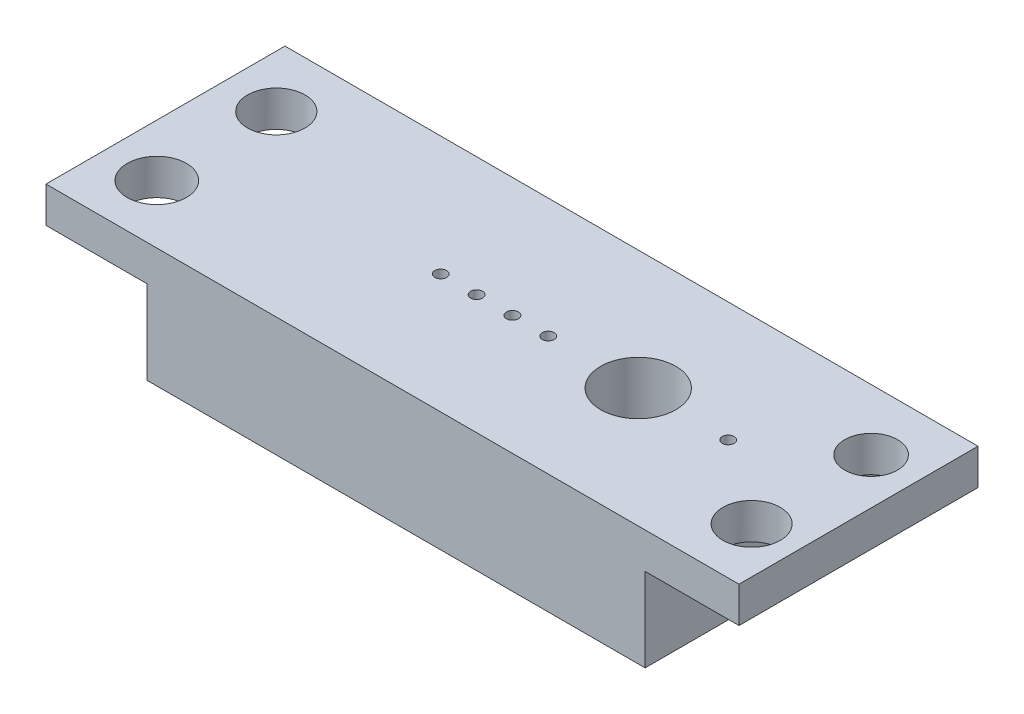
ISO-10303-21;
HEADER;
FILE_DESCRIPTION(('STEP AP214'),'2;1');
FILE_NAME('part.step','',(''),(''),'','','');
FILE_SCHEMA(('AUTOMOTIVE_DESIGN { 1 0 10303 214 1 1 1 1 }'));
ENDSEC;
DATA;
#1=APPLICATION_CONTEXT('core data for automotive mechanical design processes');
#2=APPLICATION_PROTOCOL_DEFINITION('international standard','automotive_design',2000,#1);
#3=PRODUCT_CONTEXT('',#1,'mechanical');
#4=PRODUCT('Part','Part','',(#3));
#5=PRODUCT_RELATED_PRODUCT_CATEGORY('part','',(#4));
#6=PRODUCT_DEFINITION_FORMATION('','',#4);
#7=PRODUCT_DEFINITION_CONTEXT('part definition',#1,'design');
#8=PRODUCT_DEFINITION('design','',#6,#7);
#9=PRODUCT_DEFINITION_SHAPE('','',#8);
#10=(LENGTH_UNIT() NAMED_UNIT(*) SI_UNIT(.MILLI.,.METRE.));
#11=(NAMED_UNIT(*) PLANE_ANGLE_UNIT() SI_UNIT($,.RADIAN.));
#12=(NAMED_UNIT(*) SI_UNIT($,.STERADIAN.) SOLID_ANGLE_UNIT());
#13=UNCERTAINTY_MEASURE_WITH_UNIT(LENGTH_MEASURE(1.E-05),#10,'distance_accuracy_value','');
#14=(GEOMETRIC_REPRESENTATION_CONTEXT(3) GLOBAL_UNCERTAINTY_ASSIGNED_CONTEXT((#13)) GLOBAL_UNIT_ASSIGNED_CONTEXT((#10,
#11,#12)) REPRESENTATION_CONTEXT('',''));
#15=CARTESIAN_POINT('',(0.,0.,0.));
#16=DIRECTION('',(0.,0.,1.));
#17=DIRECTION('',(1.,0.,0.));
#18=AXIS2_PLACEMENT_3D('',#15,#16,#17);
#19=CARTESIAN_POINT('',(0.,0.,0.));
#20=DIRECTION('',(0.,-1.,0.));
#21=DIRECTION('',(0.,0.,-1.));
#22=AXIS2_PLACEMENT_3D('',#19,#20,#21);
#23=PLANE('',#22);
#24=DIRECTION('',(0.,0.,1.));
#25=VECTOR('',#24,1.);
#26=CARTESIAN_POINT('',(50.139656613767,0.,0.));
#27=LINE('',#26,#25);
#28=CARTESIAN_POINT('',(50.139656613767,0.,-20.));
#29=VERTEX_POINT('',#28);
#30=CARTESIAN_POINT('',(50.139656613767,0.,0.));
#31=VERTEX_POINT('',#30);
#32=EDGE_CURVE('E125',#29,#31,#27,.T.);
#33=ORIENTED_EDGE('',*,*,#32,.F.);
#34=DIRECTION('',(-1.,0.,0.));
#35=VECTOR('',#34,1.);
#36=CARTESIAN_POINT('',(0.,0.,-20.));
#37=LINE('',#36,#35);
#38=CARTESIAN_POINT('',(58.,0.,-20.));
#39=VERTEX_POINT('',#38);
#40=EDGE_CURVE('E107',#39,#29,#37,.T.);
#41=ORIENTED_EDGE('',*,*,#40,.F.);
#42=DIRECTION('',(0.,0.,-1.));
#43=VECTOR('',#42,1.);
#44=CARTESIAN_POINT('',(58.,0.,0.));
#45=LINE('',#44,#43);
#46=CARTESIAN_POINT('',(58.,0.,0.));
#47=VERTEX_POINT('',#46);
#48=EDGE_CURVE('E108',#47,#39,#45,.T.);
#49=ORIENTED_EDGE('',*,*,#48,.F.);
#50=DIRECTION('',(1.,0.,0.));
#51=VECTOR('',#50,1.);
#52=CARTESIAN_POINT('',(0.,0.,0.));
#53=LINE('',#52,#51);
#54=EDGE_CURVE('E50',#31,#47,#53,.T.);
#55=ORIENTED_EDGE('',*,*,#54,.F.);
#56=EDGE_LOOP('',(#33,#41,#49,#55));
#57=FACE_BOUND('',#56,.T.);
#58=CARTESIAN_POINT('',(54.1549629585132,0.,-14.8987625140643));
#59=DIRECTION('',(0.,-1.,0.));
#60=DIRECTION('',(0.,0.,-1.));
#61=AXIS2_PLACEMENT_3D('',#58,#59,#60);
#62=CIRCLE('',#61,2.21071846050072);
#63=CARTESIAN_POINT('',(54.1549629585132,0.,-17.109480974565));
#64=VERTEX_POINT('',#63);
#65=EDGE_CURVE('E151',#64,#64,#62,.T.);
#66=ORIENTED_EDGE('',*,*,#65,.F.);
#67=EDGE_LOOP('',(#66));
#68=FACE_BOUND('',#67,.T.);
#69=CARTESIAN_POINT('',(54.1549629585132,0.,-4.89876251406428));
#70=DIRECTION('',(0.,-1.,0.));
#71=DIRECTION('',(0.,0.,-1.));
#72=AXIS2_PLACEMENT_3D('',#69,#70,#71);
#73=CIRCLE('',#72,2.39976438499738);
#74=CARTESIAN_POINT('',(54.1549629585132,0.,-7.29852689906166));
#75=VERTEX_POINT('',#74);
#76=EDGE_CURVE('E175',#75,#75,#73,.T.);
#77=ORIENTED_EDGE('',*,*,#76,.F.);
#78=EDGE_LOOP('',(#77));
#79=FACE_BOUND('',#78,.T.);
#80=ADVANCED_FACE('F33',(#57,#68,#79),#23,.T.);
#81=CARTESIAN_POINT('',(0.,3.,0.));
#82=DIRECTION('',(1.,0.,0.));
#83=DIRECTION('',(0.,0.,-1.));
#84=AXIS2_PLACEMENT_3D('',#81,#82,#83);
#85=PLANE('',#84);
#86=DIRECTION('',(0.,0.,1.));
#87=VECTOR('',#86,1.);
#88=CARTESIAN_POINT('',(0.,0.,0.));
#89=LINE('',#88,#87);
#90=CARTESIAN_POINT('',(0.,0.,-20.));
#91=VERTEX_POINT('',#90);
#92=CARTESIAN_POINT('',(0.,0.,0.));
#93=VERTEX_POINT('',#92);
#94=EDGE_CURVE('E103',#91,#93,#89,.T.);
#95=ORIENTED_EDGE('',*,*,#94,.T.);
#96=DIRECTION('',(0.,-1.,0.));
#97=VECTOR('',#96,1.);
#98=CARTESIAN_POINT('',(0.,3.,0.));
#99=LINE('',#98,#97);
#100=CARTESIAN_POINT('',(0.,3.,0.));
#101=VERTEX_POINT('',#100);
#102=EDGE_CURVE('E11',#101,#93,#99,.T.);
#103=ORIENTED_EDGE('',*,*,#102,.F.);
#104=DIRECTION('',(0.,0.,1.));
#105=VECTOR('',#104,1.);
#106=CARTESIAN_POINT('',(0.,3.,0.));
#107=LINE('',#106,#105);
#108=CARTESIAN_POINT('',(0.,3.,-20.));
#109=VERTEX_POINT('',#108);
#110=EDGE_CURVE('E152',#109,#101,#107,.T.);
#111=ORIENTED_EDGE('',*,*,#110,.F.);
#112=DIRECTION('',(0.,-1.,0.));
#113=VECTOR('',#112,1.);
#114=CARTESIAN_POINT('',(0.,3.,-20.));
#115=LINE('',#114,#113);
#116=EDGE_CURVE('E161',#109,#91,#115,.T.);
#117=ORIENTED_EDGE('',*,*,#116,.T.);
#118=EDGE_LOOP('',(#95,#103,#111,#117));
#119=FACE_BOUND('',#118,.T.);
#120=ADVANCED_FACE('F35',(#119),#85,.F.);
#121=CARTESIAN_POINT('',(0.,3.,0.));
#122=DIRECTION('',(0.,0.,-1.));
#123=DIRECTION('',(-1.,0.,0.));
#124=AXIS2_PLACEMENT_3D('',#121,#122,#123);
#125=PLANE('',#124);
#126=CARTESIAN_POINT('',(8.43283465638352,0.,0.));
#127=VERTEX_POINT('',#126);
#128=EDGE_CURVE('E164',#93,#127,#53,.T.);
#129=ORIENTED_EDGE('',*,*,#128,.T.);
#130=DIRECTION('',(0.,1.,0.));
#131=VECTOR('',#130,1.);
#132=CARTESIAN_POINT('',(8.43283465638352,-53.2542862639224,0.));
#133=LINE('',#132,#131);
#134=CARTESIAN_POINT('',(8.43283465638352,-7.,0.));
#135=VERTEX_POINT('',#134);
#136=EDGE_CURVE('E119',#135,#127,#133,.T.);
#137=ORIENTED_EDGE('',*,*,#136,.F.);
#138=DIRECTION('',(1.,0.,0.));
#139=VECTOR('',#138,1.);
#140=CARTESIAN_POINT('',(50.139656613767,-7.,0.));
#141=LINE('',#140,#139);
#142=CARTESIAN_POINT('',(50.139656613767,-7.,0.));
#143=VERTEX_POINT('',#142);
#144=EDGE_CURVE('E226',#135,#143,#141,.T.);
#145=ORIENTED_EDGE('',*,*,#144,.T.);
#146=DIRECTION('',(0.,1.,0.));
#147=VECTOR('',#146,1.);
#148=CARTESIAN_POINT('',(50.139656613767,-53.2542862639224,0.));
#149=LINE('',#148,#147);
#150=EDGE_CURVE('E134',#143,#31,#149,.T.);
#151=ORIENTED_EDGE('',*,*,#150,.T.);
#152=ORIENTED_EDGE('',*,*,#54,.T.);
#153=DIRECTION('',(0.,-1.,0.));
#154=VECTOR('',#153,1.);
#155=CARTESIAN_POINT('',(58.,3.,0.));
#156=LINE('',#155,#154);
#157=CARTESIAN_POINT('',(58.,3.,0.));
#158=VERTEX_POINT('',#157);
#159=EDGE_CURVE('E42',#158,#47,#156,.T.);
#160=ORIENTED_EDGE('',*,*,#159,.F.);
#161=DIRECTION('',(1.,0.,0.));
#162=VECTOR('',#161,1.);
#163=CARTESIAN_POINT('',(0.,3.,0.));
#164=LINE('',#163,#162);
#165=EDGE_CURVE('E155',#101,#158,#164,.T.);
#166=ORIENTED_EDGE('',*,*,#165,.F.);
#167=ORIENTED_EDGE('',*,*,#102,.T.);
#168=EDGE_LOOP('',(#129,#137,#145,#151,#152,#160,#166,#167));
#169=FACE_BOUND('',#168,.T.);
#170=ADVANCED_FACE('F213',(#169),#125,.F.);
#171=CARTESIAN_POINT('',(58.,3.,0.));
#172=DIRECTION('',(-1.,0.,0.));
#173=DIRECTION('',(0.,0.,1.));
#174=AXIS2_PLACEMENT_3D('',#171,#172,#173);
#175=PLANE('',#174);
#176=ORIENTED_EDGE('',*,*,#48,.T.);
#177=DIRECTION('',(0.,-1.,0.));
#178=VECTOR('',#177,1.);
#179=CARTESIAN_POINT('',(58.,3.,-20.));
#180=LINE('',#179,#178);
#181=CARTESIAN_POINT('',(58.,3.,-20.));
#182=VERTEX_POINT('',#181);
#183=EDGE_CURVE('E168',#182,#39,#180,.T.);
#184=ORIENTED_EDGE('',*,*,#183,.F.);
#185=DIRECTION('',(0.,0.,-1.));
#186=VECTOR('',#185,1.);
#187=CARTESIAN_POINT('',(58.,3.,0.));
#188=LINE('',#187,#186);
#189=EDGE_CURVE('E157',#158,#182,#188,.T.);
#190=ORIENTED_EDGE('',*,*,#189,.F.);
#191=ORIENTED_EDGE('',*,*,#159,.T.);
#192=EDGE_LOOP('',(#176,#184,#190,#191));
#193=FACE_BOUND('',#192,.T.);
#194=ADVANCED_FACE('F217',(#193),#175,.F.);
#195=CARTESIAN_POINT('',(0.,3.,-20.));
#196=DIRECTION('',(0.,0.,1.));
#197=DIRECTION('',(1.,0.,0.));
#198=AXIS2_PLACEMENT_3D('',#195,#196,#197);
#199=PLANE('',#198);
#200=ORIENTED_EDGE('',*,*,#40,.T.);
#201=DIRECTION('',(0.,1.,0.));
#202=VECTOR('',#201,1.);
#203=CARTESIAN_POINT('',(50.139656613767,-53.2542862639224,-20.));
#204=LINE('',#203,#202);
#205=CARTESIAN_POINT('',(50.139656613767,-7.,-20.));
#206=VERTEX_POINT('',#205);
#207=EDGE_CURVE('E120',#206,#29,#204,.T.);
#208=ORIENTED_EDGE('',*,*,#207,.F.);
#209=DIRECTION('',(-1.,0.,0.));
#210=VECTOR('',#209,1.);
#211=CARTESIAN_POINT('',(50.139656613767,-7.,-20.));
#212=LINE('',#211,#210);
#213=CARTESIAN_POINT('',(8.43283465638352,-7.,-20.));
#214=VERTEX_POINT('',#213);
#215=EDGE_CURVE('E116',#206,#214,#212,.T.);
#216=ORIENTED_EDGE('',*,*,#215,.T.);
#217=DIRECTION('',(0.,1.,0.));
#218=VECTOR('',#217,1.);
#219=CARTESIAN_POINT('',(8.43283465638352,-53.2542862639224,-20.));
#220=LINE('',#219,#218);
#221=CARTESIAN_POINT('',(8.43283465638352,0.,-20.));
#222=VERTEX_POINT('',#221);
#223=EDGE_CURVE('E112',#214,#222,#220,.T.);
#224=ORIENTED_EDGE('',*,*,#223,.T.);
#225=EDGE_CURVE('E98',#222,#91,#37,.T.);
#226=ORIENTED_EDGE('',*,*,#225,.T.);
#227=ORIENTED_EDGE('',*,*,#116,.F.);
#228=DIRECTION('',(-1.,0.,0.));
#229=VECTOR('',#228,1.);
#230=CARTESIAN_POINT('',(0.,3.,-20.));
#231=LINE('',#230,#229);
#232=EDGE_CURVE('E159',#182,#109,#231,.T.);
#233=ORIENTED_EDGE('',*,*,#232,.F.);
#234=ORIENTED_EDGE('',*,*,#183,.T.);
#235=EDGE_LOOP('',(#200,#208,#216,#224,#226,#227,#233,#234));
#236=FACE_BOUND('',#235,.T.);
#237=ADVANCED_FACE('F114',(#236),#199,.F.);
#238=CARTESIAN_POINT('',(0.,3.,0.));
#239=DIRECTION('',(0.,-1.,0.));
#240=DIRECTION('',(0.,0.,-1.));
#241=AXIS2_PLACEMENT_3D('',#238,#239,#240);
#242=PLANE('',#241);
#243=CARTESIAN_POINT('',(47.0953496575369,3.,-10.0000000000001));
#244=DIRECTION('',(0.,-1.,0.));
#245=DIRECTION('',(0.,0.,-1.));
#246=AXIS2_PLACEMENT_3D('',#243,#244,#245);
#247=CIRCLE('',#246,0.499999999999523);
#248=CARTESIAN_POINT('',(47.0953496575369,3.,-10.4999999999996));
#249=VERTEX_POINT('',#248);
#250=EDGE_CURVE('E233',#249,#249,#247,.T.);
#251=ORIENTED_EDGE('',*,*,#250,.T.);
#252=EDGE_LOOP('',(#251));
#253=FACE_BOUND('',#252,.T.);
#254=CARTESIAN_POINT('',(32.0353496575364,3.,-10.));
#255=DIRECTION('',(0.,-1.,0.));
#256=DIRECTION('',(0.,0.,-1.));
#257=AXIS2_PLACEMENT_3D('',#254,#255,#256);
#258=CIRCLE('',#257,0.499999999999912);
#259=CARTESIAN_POINT('',(32.0353496575364,3.,-10.4999999999999));
#260=VERTEX_POINT('',#259);
#261=EDGE_CURVE('E236',#260,#260,#258,.T.);
#262=ORIENTED_EDGE('',*,*,#261,.T.);
#263=EDGE_LOOP('',(#262));
#264=FACE_BOUND('',#263,.T.);
#265=CARTESIAN_POINT('',(23.0353496575364,3.,-10.));
#266=DIRECTION('',(0.,-1.,0.));
#267=DIRECTION('',(0.,0.,-1.));
#268=AXIS2_PLACEMENT_3D('',#265,#266,#267);
#269=CIRCLE('',#268,0.499999999999918);
#270=CARTESIAN_POINT('',(23.0353496575364,3.,-10.4999999999999));
#271=VERTEX_POINT('',#270);
#272=EDGE_CURVE('E239',#271,#271,#269,.T.);
#273=ORIENTED_EDGE('',*,*,#272,.T.);
#274=EDGE_LOOP('',(#273));
#275=FACE_BOUND('',#274,.T.);
#276=CARTESIAN_POINT('',(29.0353496575364,3.,-10.));
#277=DIRECTION('',(0.,-1.,0.));
#278=DIRECTION('',(0.,0.,-1.));
#279=AXIS2_PLACEMENT_3D('',#276,#277,#278);
#280=CIRCLE('',#279,0.499999999999912);
#281=CARTESIAN_POINT('',(29.0353496575364,3.,-10.4999999999999));
#282=VERTEX_POINT('',#281);
#283=EDGE_CURVE('E242',#282,#282,#280,.T.);
#284=ORIENTED_EDGE('',*,*,#283,.T.);
#285=EDGE_LOOP('',(#284));
#286=FACE_BOUND('',#285,.T.);
#287=CARTESIAN_POINT('',(26.0353496575364,3.,-10.));
#288=DIRECTION('',(0.,-1.,0.));
#289=DIRECTION('',(0.,0.,-1.));
#290=AXIS2_PLACEMENT_3D('',#287,#288,#289);
#291=CIRCLE('',#290,0.499999999999915);
#292=CARTESIAN_POINT('',(26.0353496575364,3.,-10.4999999999999));
#293=VERTEX_POINT('',#292);
#294=EDGE_CURVE('E245',#293,#293,#291,.T.);
#295=ORIENTED_EDGE('',*,*,#294,.T.);
#296=EDGE_LOOP('',(#295));
#297=FACE_BOUND('',#296,.T.);
#298=CARTESIAN_POINT('',(39.5653496575363,3.,-10.));
#299=DIRECTION('',(0.,1.,0.));
#300=DIRECTION('',(0.,0.,1.));
#301=AXIS2_PLACEMENT_3D('',#298,#299,#300);
#302=CIRCLE('',#301,3.15);
#303=CARTESIAN_POINT('',(39.5653496575363,3.,-6.85));
#304=VERTEX_POINT('',#303);
#305=EDGE_CURVE('E230',#304,#304,#302,.T.);
#306=ORIENTED_EDGE('',*,*,#305,.F.);
#307=EDGE_LOOP('',(#306));
#308=FACE_BOUND('',#307,.T.);
#309=CARTESIAN_POINT('',(4.37573635656004,3.,-14.8987625140642));
#310=DIRECTION('',(0.,1.,0.));
#311=DIRECTION('',(0.,0.,1.));
#312=AXIS2_PLACEMENT_3D('',#309,#310,#311);
#313=CIRCLE('',#312,2.40385465522674);
#314=CARTESIAN_POINT('',(4.37573635656004,3.,-12.4949078588374));
#315=VERTEX_POINT('',#314);
#316=EDGE_CURVE('E145',#315,#315,#313,.T.);
#317=ORIENTED_EDGE('',*,*,#316,.F.);
#318=EDGE_LOOP('',(#317));
#319=FACE_BOUND('',#318,.T.);
#320=CARTESIAN_POINT('',(4.37573635656004,3.,-4.89876251406419));
#321=DIRECTION('',(0.,1.,0.));
#322=DIRECTION('',(0.,0.,1.));
#323=AXIS2_PLACEMENT_3D('',#320,#321,#322);
#324=CIRCLE('',#323,2.4788490809737);
#325=CARTESIAN_POINT('',(4.37573635656004,3.,-2.4199134330905));
#326=VERTEX_POINT('',#325);
#327=EDGE_CURVE('E142',#326,#326,#324,.T.);
#328=ORIENTED_EDGE('',*,*,#327,.F.);
#329=EDGE_LOOP('',(#328));
#330=FACE_BOUND('',#329,.T.);
#331=CARTESIAN_POINT('',(54.1549629585132,3.,-4.89876251406428));
#332=DIRECTION('',(0.,1.,0.));
#333=DIRECTION('',(0.,0.,1.));
#334=AXIS2_PLACEMENT_3D('',#331,#332,#333);
#335=CIRCLE('',#334,2.39976438499738);
#336=CARTESIAN_POINT('',(54.1549629585132,3.,-2.4989981290669));
#337=VERTEX_POINT('',#336);
#338=EDGE_CURVE('E138',#337,#337,#335,.T.);
#339=ORIENTED_EDGE('',*,*,#338,.F.);
#340=EDGE_LOOP('',(#339));
#341=FACE_BOUND('',#340,.T.);
#342=CARTESIAN_POINT('',(54.1549629585132,3.,-14.8987625140643));
#343=DIRECTION('',(0.,1.,0.));
#344=DIRECTION('',(0.,0.,1.));
#345=AXIS2_PLACEMENT_3D('',#342,#343,#344);
#346=CIRCLE('',#345,2.21071846050072);
#347=CARTESIAN_POINT('',(54.1549629585132,3.,-12.6880440535635));
#348=VERTEX_POINT('',#347);
#349=EDGE_CURVE('E141',#348,#348,#346,.T.);
#350=ORIENTED_EDGE('',*,*,#349,.F.);
#351=EDGE_LOOP('',(#350));
#352=FACE_BOUND('',#351,.T.);
#353=ORIENTED_EDGE('',*,*,#110,.T.);
#354=ORIENTED_EDGE('',*,*,#165,.T.);
#355=ORIENTED_EDGE('',*,*,#189,.T.);
#356=ORIENTED_EDGE('',*,*,#232,.T.);
#357=EDGE_LOOP('',(#353,#354,#355,#356));
#358=FACE_BOUND('',#357,.T.);
#359=ADVANCED_FACE('F188',(#253,#264,#275,#286,#297,#308,#319,#330,#341,#352,#358),#242,.F.);
#360=DIRECTION('',(0.,0.,-1.));
#361=VECTOR('',#360,1.);
#362=CARTESIAN_POINT('',(8.43283465638352,0.,0.));
#363=LINE('',#362,#361);
#364=EDGE_CURVE('E58',#127,#222,#363,.T.);
#365=ORIENTED_EDGE('',*,*,#364,.F.);
#366=ORIENTED_EDGE('',*,*,#128,.F.);
#367=ORIENTED_EDGE('',*,*,#94,.F.);
#368=ORIENTED_EDGE('',*,*,#225,.F.);
#369=EDGE_LOOP('',(#365,#366,#367,#368));
#370=FACE_BOUND('',#369,.T.);
#371=CARTESIAN_POINT('',(4.37573635656004,0.,-14.8987625140642));
#372=DIRECTION('',(0.,-1.,0.));
#373=DIRECTION('',(0.,0.,-1.));
#374=AXIS2_PLACEMENT_3D('',#371,#372,#373);
#375=CIRCLE('',#374,2.40385465522674);
#376=CARTESIAN_POINT('',(4.37573635656004,0.,-17.3026171692909));
#377=VERTEX_POINT('',#376);
#378=EDGE_CURVE('E163',#377,#377,#375,.T.);
#379=ORIENTED_EDGE('',*,*,#378,.F.);
#380=EDGE_LOOP('',(#379));
#381=FACE_BOUND('',#380,.T.);
#382=CARTESIAN_POINT('',(4.37573635656004,0.,-4.89876251406419));
#383=DIRECTION('',(0.,-1.,0.));
#384=DIRECTION('',(0.,0.,-1.));
#385=AXIS2_PLACEMENT_3D('',#382,#383,#384);
#386=CIRCLE('',#385,2.4788490809737);
#387=CARTESIAN_POINT('',(4.37573635656004,0.,-7.37761159503789));
#388=VERTEX_POINT('',#387);
#389=EDGE_CURVE('E178',#388,#388,#386,.T.);
#390=ORIENTED_EDGE('',*,*,#389,.F.);
#391=EDGE_LOOP('',(#390));
#392=FACE_BOUND('',#391,.T.);
#393=ADVANCED_FACE('F100',(#370,#381,#392),#23,.T.);
#394=CARTESIAN_POINT('',(54.1549629585132,-7.,-14.8987625140643));
#395=DIRECTION('',(0.,1.,0.));
#396=DIRECTION('',(0.,0.,1.));
#397=AXIS2_PLACEMENT_3D('',#394,#395,#396);
#398=CYLINDRICAL_SURFACE('',#397,2.21071846050072);
#399=ORIENTED_EDGE('',*,*,#65,.T.);
#400=EDGE_LOOP('',(#399));
#401=FACE_BOUND('',#400,.T.);
#402=ORIENTED_EDGE('',*,*,#349,.T.);
#403=EDGE_LOOP('',(#402));
#404=FACE_BOUND('',#403,.T.);
#405=ADVANCED_FACE('F187',(#401,#404),#398,.F.);
#406=CARTESIAN_POINT('',(54.1549629585132,-7.,-4.89876251406428));
#407=DIRECTION('',(0.,1.,0.));
#408=DIRECTION('',(0.,0.,1.));
#409=AXIS2_PLACEMENT_3D('',#406,#407,#408);
#410=CYLINDRICAL_SURFACE('',#409,2.39976438499738);
#411=ORIENTED_EDGE('',*,*,#76,.T.);
#412=EDGE_LOOP('',(#411));
#413=FACE_BOUND('',#412,.T.);
#414=ORIENTED_EDGE('',*,*,#338,.T.);
#415=EDGE_LOOP('',(#414));
#416=FACE_BOUND('',#415,.T.);
#417=ADVANCED_FACE('F195',(#413,#416),#410,.F.);
#418=CARTESIAN_POINT('',(4.37573635656004,-7.,-4.89876251406419));
#419=DIRECTION('',(0.,1.,0.));
#420=DIRECTION('',(0.,0.,1.));
#421=AXIS2_PLACEMENT_3D('',#418,#419,#420);
#422=CYLINDRICAL_SURFACE('',#421,2.4788490809737);
#423=ORIENTED_EDGE('',*,*,#389,.T.);
#424=EDGE_LOOP('',(#423));
#425=FACE_BOUND('',#424,.T.);
#426=ORIENTED_EDGE('',*,*,#327,.T.);
#427=EDGE_LOOP('',(#426));
#428=FACE_BOUND('',#427,.T.);
#429=ADVANCED_FACE('F192',(#425,#428),#422,.F.);
#430=CARTESIAN_POINT('',(4.37573635656004,-7.,-14.8987625140642));
#431=DIRECTION('',(0.,1.,0.));
#432=DIRECTION('',(0.,0.,1.));
#433=AXIS2_PLACEMENT_3D('',#430,#431,#432);
#434=CYLINDRICAL_SURFACE('',#433,2.40385465522674);
#435=ORIENTED_EDGE('',*,*,#378,.T.);
#436=EDGE_LOOP('',(#435));
#437=FACE_BOUND('',#436,.T.);
#438=ORIENTED_EDGE('',*,*,#316,.T.);
#439=EDGE_LOOP('',(#438));
#440=FACE_BOUND('',#439,.T.);
#441=ADVANCED_FACE('F183',(#437,#440),#434,.F.);
#442=CARTESIAN_POINT('',(8.43283465638352,-53.2542862639224,0.));
#443=DIRECTION('',(1.,0.,0.));
#444=DIRECTION('',(0.,0.,-1.));
#445=AXIS2_PLACEMENT_3D('',#442,#443,#444);
#446=PLANE('',#445);
#447=ORIENTED_EDGE('',*,*,#223,.F.);
#448=DIRECTION('',(0.,0.,1.));
#449=VECTOR('',#448,1.);
#450=CARTESIAN_POINT('',(8.43283465638352,-7.,0.));
#451=LINE('',#450,#449);
#452=EDGE_CURVE('E137',#214,#135,#451,.T.);
#453=ORIENTED_EDGE('',*,*,#452,.T.);
#454=ORIENTED_EDGE('',*,*,#136,.T.);
#455=ORIENTED_EDGE('',*,*,#364,.T.);
#456=EDGE_LOOP('',(#447,#453,#454,#455));
#457=FACE_BOUND('',#456,.T.);
#458=ADVANCED_FACE('F123',(#457),#446,.F.);
#459=CARTESIAN_POINT('',(50.139656613767,-53.2542862639224,0.));
#460=DIRECTION('',(-1.,0.,0.));
#461=DIRECTION('',(0.,0.,1.));
#462=AXIS2_PLACEMENT_3D('',#459,#460,#461);
#463=PLANE('',#462);
#464=ORIENTED_EDGE('',*,*,#150,.F.);
#465=DIRECTION('',(0.,0.,-1.));
#466=VECTOR('',#465,1.);
#467=CARTESIAN_POINT('',(50.139656613767,-7.,0.));
#468=LINE('',#467,#466);
#469=EDGE_CURVE('E148',#143,#206,#468,.T.);
#470=ORIENTED_EDGE('',*,*,#469,.T.);
#471=ORIENTED_EDGE('',*,*,#207,.T.);
#472=ORIENTED_EDGE('',*,*,#32,.T.);
#473=EDGE_LOOP('',(#464,#470,#471,#472));
#474=FACE_BOUND('',#473,.T.);
#475=ADVANCED_FACE('F222',(#474),#463,.F.);
#476=CARTESIAN_POINT('',(-15.4346503424635,-7.,2.60123748593555));
#477=DIRECTION('',(0.,1.,0.));
#478=DIRECTION('',(0.,0.,1.));
#479=AXIS2_PLACEMENT_3D('',#476,#477,#478);
#480=PLANE('',#479);
#481=CARTESIAN_POINT('',(47.0953496575369,-7.,-10.0000000000001));
#482=DIRECTION('',(0.,-1.,0.));
#483=DIRECTION('',(0.,0.,-1.));
#484=AXIS2_PLACEMENT_3D('',#481,#482,#483);
#485=CIRCLE('',#484,0.499999999999523);
#486=CARTESIAN_POINT('',(47.0953496575369,-7.,-10.4999999999996));
#487=VERTEX_POINT('',#486);
#488=EDGE_CURVE('E252',#487,#487,#485,.T.);
#489=ORIENTED_EDGE('',*,*,#488,.F.);
#490=EDGE_LOOP('',(#489));
#491=FACE_BOUND('',#490,.T.);
#492=CARTESIAN_POINT('',(32.0353496575364,-7.,-10.));
#493=DIRECTION('',(0.,-1.,0.));
#494=DIRECTION('',(0.,0.,-1.));
#495=AXIS2_PLACEMENT_3D('',#492,#493,#494);
#496=CIRCLE('',#495,0.499999999999912);
#497=CARTESIAN_POINT('',(32.0353496575364,-7.,-10.4999999999999));
#498=VERTEX_POINT('',#497);
#499=EDGE_CURVE('E255',#498,#498,#496,.T.);
#500=ORIENTED_EDGE('',*,*,#499,.F.);
#501=EDGE_LOOP('',(#500));
#502=FACE_BOUND('',#501,.T.);
#503=CARTESIAN_POINT('',(23.0353496575364,-7.,-10.));
#504=DIRECTION('',(0.,-1.,0.));
#505=DIRECTION('',(0.,0.,-1.));
#506=AXIS2_PLACEMENT_3D('',#503,#504,#505);
#507=CIRCLE('',#506,0.499999999999918);
#508=CARTESIAN_POINT('',(23.0353496575364,-7.,-10.4999999999999));
#509=VERTEX_POINT('',#508);
#510=EDGE_CURVE('E258',#509,#509,#507,.T.);
#511=ORIENTED_EDGE('',*,*,#510,.F.);
#512=EDGE_LOOP('',(#511));
#513=FACE_BOUND('',#512,.T.);
#514=CARTESIAN_POINT('',(29.0353496575364,-7.,-10.));
#515=DIRECTION('',(0.,-1.,0.));
#516=DIRECTION('',(0.,0.,-1.));
#517=AXIS2_PLACEMENT_3D('',#514,#515,#516);
#518=CIRCLE('',#517,0.499999999999912);
#519=CARTESIAN_POINT('',(29.0353496575364,-7.,-10.4999999999999));
#520=VERTEX_POINT('',#519);
#521=EDGE_CURVE('E251',#520,#520,#518,.T.);
#522=ORIENTED_EDGE('',*,*,#521,.F.);
#523=EDGE_LOOP('',(#522));
#524=FACE_BOUND('',#523,.T.);
#525=CARTESIAN_POINT('',(26.0353496575364,-7.,-10.));
#526=DIRECTION('',(0.,-1.,0.));
#527=DIRECTION('',(0.,0.,-1.));
#528=AXIS2_PLACEMENT_3D('',#525,#526,#527);
#529=CIRCLE('',#528,0.499999999999915);
#530=CARTESIAN_POINT('',(26.0353496575364,-7.,-10.4999999999999));
#531=VERTEX_POINT('',#530);
#532=EDGE_CURVE('E248',#531,#531,#529,.T.);
#533=ORIENTED_EDGE('',*,*,#532,.F.);
#534=EDGE_LOOP('',(#533));
#535=FACE_BOUND('',#534,.T.);
#536=CARTESIAN_POINT('',(39.5653496575363,-7.,-10.));
#537=DIRECTION('',(0.,1.,0.));
#538=DIRECTION('',(0.,0.,1.));
#539=AXIS2_PLACEMENT_3D('',#536,#537,#538);
#540=CIRCLE('',#539,3.15);
#541=CARTESIAN_POINT('',(39.5653496575363,-7.,-6.85));
#542=VERTEX_POINT('',#541);
#543=EDGE_CURVE('E37',#542,#542,#540,.T.);
#544=ORIENTED_EDGE('',*,*,#543,.T.);
#545=EDGE_LOOP('',(#544));
#546=FACE_BOUND('',#545,.T.);
#547=ORIENTED_EDGE('',*,*,#144,.F.);
#548=ORIENTED_EDGE('',*,*,#452,.F.);
#549=ORIENTED_EDGE('',*,*,#215,.F.);
#550=ORIENTED_EDGE('',*,*,#469,.F.);
#551=EDGE_LOOP('',(#547,#548,#549,#550));
#552=FACE_BOUND('',#551,.T.);
#553=ADVANCED_FACE('F267',(#491,#502,#513,#524,#535,#546,#552),#480,.F.);
#554=CARTESIAN_POINT('',(39.5653496575363,-17.,-10.));
#555=DIRECTION('',(0.,1.,0.));
#556=DIRECTION('',(0.,0.,1.));
#557=AXIS2_PLACEMENT_3D('',#554,#555,#556);
#558=CYLINDRICAL_SURFACE('',#557,3.15);
#559=ORIENTED_EDGE('',*,*,#305,.T.);
#560=EDGE_LOOP('',(#559));
#561=FACE_BOUND('',#560,.T.);
#562=ORIENTED_EDGE('',*,*,#543,.F.);
#563=EDGE_LOOP('',(#562));
#564=FACE_BOUND('',#563,.T.);
#565=ADVANCED_FACE('F270',(#561,#564),#558,.F.);
#566=CARTESIAN_POINT('',(26.0353496575364,15.,-10.));
#567=DIRECTION('',(0.,-1.,0.));
#568=DIRECTION('',(0.,0.,-1.));
#569=AXIS2_PLACEMENT_3D('',#566,#567,#568);
#570=CYLINDRICAL_SURFACE('',#569,0.499999999999915);
#571=ORIENTED_EDGE('',*,*,#532,.T.);
#572=EDGE_LOOP('',(#571));
#573=FACE_BOUND('',#572,.T.);
#574=ORIENTED_EDGE('',*,*,#294,.F.);
#575=EDGE_LOOP('',(#574));
#576=FACE_BOUND('',#575,.T.);
#577=ADVANCED_FACE('F279',(#573,#576),#570,.F.);
#578=CARTESIAN_POINT('',(29.0353496575364,15.,-10.));
#579=DIRECTION('',(0.,-1.,0.));
#580=DIRECTION('',(0.,0.,-1.));
#581=AXIS2_PLACEMENT_3D('',#578,#579,#580);
#582=CYLINDRICAL_SURFACE('',#581,0.499999999999912);
#583=ORIENTED_EDGE('',*,*,#521,.T.);
#584=EDGE_LOOP('',(#583));
#585=FACE_BOUND('',#584,.T.);
#586=ORIENTED_EDGE('',*,*,#283,.F.);
#587=EDGE_LOOP('',(#586));
#588=FACE_BOUND('',#587,.T.);
#589=ADVANCED_FACE('F264',(#585,#588),#582,.F.);
#590=CARTESIAN_POINT('',(23.0353496575364,15.,-10.));
#591=DIRECTION('',(0.,-1.,0.));
#592=DIRECTION('',(0.,0.,-1.));
#593=AXIS2_PLACEMENT_3D('',#590,#591,#592);
#594=CYLINDRICAL_SURFACE('',#593,0.499999999999918);
#595=ORIENTED_EDGE('',*,*,#510,.T.);
#596=EDGE_LOOP('',(#595));
#597=FACE_BOUND('',#596,.T.);
#598=ORIENTED_EDGE('',*,*,#272,.F.);
#599=EDGE_LOOP('',(#598));
#600=FACE_BOUND('',#599,.T.);
#601=ADVANCED_FACE('F372',(#597,#600),#594,.F.);
#602=CARTESIAN_POINT('',(32.0353496575364,15.,-10.));
#603=DIRECTION('',(0.,-1.,0.));
#604=DIRECTION('',(0.,0.,-1.));
#605=AXIS2_PLACEMENT_3D('',#602,#603,#604);
#606=CYLINDRICAL_SURFACE('',#605,0.499999999999912);
#607=ORIENTED_EDGE('',*,*,#499,.T.);
#608=EDGE_LOOP('',(#607));
#609=FACE_BOUND('',#608,.T.);
#610=ORIENTED_EDGE('',*,*,#261,.F.);
#611=EDGE_LOOP('',(#610));
#612=FACE_BOUND('',#611,.T.);
#613=ADVANCED_FACE('F381',(#609,#612),#606,.F.);
#614=CARTESIAN_POINT('',(47.0953496575369,15.,-10.0000000000001));
#615=DIRECTION('',(0.,-1.,0.));
#616=DIRECTION('',(0.,0.,-1.));
#617=AXIS2_PLACEMENT_3D('',#614,#615,#616);
#618=CYLINDRICAL_SURFACE('',#617,0.499999999999523);
#619=ORIENTED_EDGE('',*,*,#488,.T.);
#620=EDGE_LOOP('',(#619));
#621=FACE_BOUND('',#620,.T.);
#622=ORIENTED_EDGE('',*,*,#250,.F.);
#623=EDGE_LOOP('',(#622));
#624=FACE_BOUND('',#623,.T.);
#625=ADVANCED_FACE('F391',(#621,#624),#618,.F.);
#626=CLOSED_SHELL('',(#80,#120,#170,#194,#237,#359,#393,#405,#417,#429,#441,#458,#475,#553,#565,
#577,#589,#601,#613,#625));
#627=MANIFOLD_SOLID_BREP('B2',#626);
#628=ADVANCED_BREP_SHAPE_REPRESENTATION('',(#18,#627),#14);
#629=SHAPE_DEFINITION_REPRESENTATION(#9,#628);
ENDSEC;
END-ISO-10303-21;
